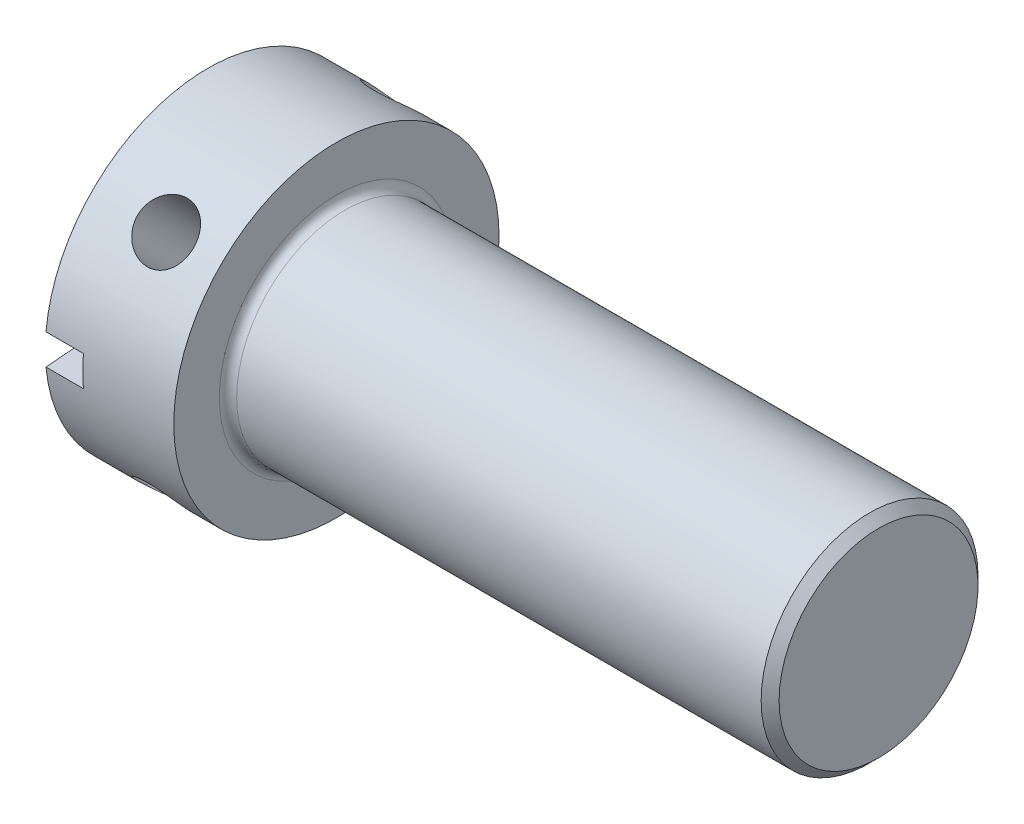
ISO-10303-21;
HEADER;
FILE_DESCRIPTION(('STEP AP214'),'2;1');
FILE_NAME('part.step','',(''),(''),'','','');
FILE_SCHEMA(('AUTOMOTIVE_DESIGN { 1 0 10303 214 1 1 1 1 }'));
ENDSEC;
DATA;
#1=APPLICATION_CONTEXT('core data for automotive mechanical design processes');
#2=APPLICATION_PROTOCOL_DEFINITION('international standard','automotive_design',2000,#1);
#3=PRODUCT_CONTEXT('',#1,'mechanical');
#4=PRODUCT('Part','Part','',(#3));
#5=PRODUCT_RELATED_PRODUCT_CATEGORY('part','',(#4));
#6=PRODUCT_DEFINITION_FORMATION('','',#4);
#7=PRODUCT_DEFINITION_CONTEXT('part definition',#1,'design');
#8=PRODUCT_DEFINITION('design','',#6,#7);
#9=PRODUCT_DEFINITION_SHAPE('','',#8);
#10=(LENGTH_UNIT() NAMED_UNIT(*) SI_UNIT(.MILLI.,.METRE.));
#11=(NAMED_UNIT(*) PLANE_ANGLE_UNIT() SI_UNIT($,.RADIAN.));
#12=(NAMED_UNIT(*) SI_UNIT($,.STERADIAN.) SOLID_ANGLE_UNIT());
#13=UNCERTAINTY_MEASURE_WITH_UNIT(LENGTH_MEASURE(1.E-05),#10,'distance_accuracy_value','');
#14=(GEOMETRIC_REPRESENTATION_CONTEXT(3) GLOBAL_UNCERTAINTY_ASSIGNED_CONTEXT((#13)) GLOBAL_UNIT_ASSIGNED_CONTEXT((#10,
#11,#12)) REPRESENTATION_CONTEXT('',''));
#15=CARTESIAN_POINT('',(0.,0.,0.));
#16=DIRECTION('',(0.,0.,1.));
#17=DIRECTION('',(1.,0.,0.));
#18=AXIS2_PLACEMENT_3D('',#15,#16,#17);
#19=CARTESIAN_POINT('',(7.35,-15.,-15.));
#20=DIRECTION('',(0.,0.707106781186546,0.707106781186549));
#21=DIRECTION('',(0.,-0.707106781186549,0.707106781186546));
#22=AXIS2_PLACEMENT_3D('',#19,#20,#21);
#23=CYLINDRICAL_SURFACE('',#22,2.59);
#24=CARTESIAN_POINT('',(7.35,8.61588734472041,12.2787004712668));
#25=CARTESIAN_POINT('',(7.49431317893943,8.61589328280588,12.2786983033954));
#26=CARTESIAN_POINT('',(7.63870324113097,8.62595636370754,12.271654071113));
#27=CARTESIAN_POINT('',(7.92342648497461,8.66579641696934,12.2435511234337));
#28=CARTESIAN_POINT('',(8.06375588911612,8.69559116639336,12.2224797703431));
#29=CARTESIAN_POINT('',(8.33619628854521,8.77359052912569,12.1666098173191));
#30=CARTESIAN_POINT('',(8.46831425556491,8.82177927012199,12.1318230516676));
#31=CARTESIAN_POINT('',(8.72081834637599,8.93459637035538,12.048977682007));
#32=CARTESIAN_POINT('',(8.84120567606902,8.99922303731351,12.0009204441451));
#33=CARTESIAN_POINT('',(9.06811660351881,9.14311619219944,11.8916626638595));
#34=CARTESIAN_POINT('',(9.17449819752444,9.22251545511193,11.8303420264751));
#35=CARTESIAN_POINT('',(9.36914339407707,9.39260855320555,11.6957532331326));
#36=CARTESIAN_POINT('',(9.45740589171919,9.48330307663166,11.6224843490574));
#37=CARTESIAN_POINT('',(9.61384359232034,9.67339833212033,11.4647586967363));
#38=CARTESIAN_POINT('',(9.68188614345174,9.77285123896529,11.3802330963039));
#39=CARTESIAN_POINT('',(9.79509929016456,9.97653165193127,11.2021023771704));
#40=CARTESIAN_POINT('',(9.84027148099626,10.0807588244852,11.1084978922812));
#41=CARTESIAN_POINT('',(9.9060259505805,10.2894983472068,10.9154124084122));
#42=CARTESIAN_POINT('',(9.92684706482816,10.3939976763809,10.8159987032624));
#43=CARTESIAN_POINT('',(9.94405143797783,10.601060134335,10.6131297793876));
#44=CARTESIAN_POINT('',(9.94043647414532,10.7036234033828,10.5096748551294));
#45=CARTESIAN_POINT('',(9.90905671178073,10.9028056755622,10.3028748341956));
#46=CARTESIAN_POINT('',(9.88154898223575,10.9994762687934,10.1995402556336));
#47=CARTESIAN_POINT('',(9.8035698164271,11.1856044025656,9.99506782693522));
#48=CARTESIAN_POINT('',(9.75309764123897,11.2750617108966,9.89393004759467));
#49=CARTESIAN_POINT('',(9.63036975450608,11.4451986208289,9.69662305942716));
#50=CARTESIAN_POINT('',(9.55800899419984,11.5258332808414,9.60048049095414));
#51=CARTESIAN_POINT('',(9.39363507257675,11.6762862581322,9.41692335155812));
#52=CARTESIAN_POINT('',(9.30162020723274,11.746103636637,9.32950953839039));
#53=CARTESIAN_POINT('',(9.09912673635516,11.874607507159,9.16540888377779));
#54=CARTESIAN_POINT('',(8.98842337997391,11.9331372787721,9.08887648655711));
#55=CARTESIAN_POINT('',(8.75245026756623,12.0370529133785,8.95080150854063));
#56=CARTESIAN_POINT('',(8.62718035738197,12.0824386372506,8.88925908640507));
#57=CARTESIAN_POINT('',(8.36536485610251,12.159496644468,8.78356111464045));
#58=CARTESIAN_POINT('',(8.22880517174112,12.1911514698394,8.73942770589612));
#59=CARTESIAN_POINT('',(7.94843515539539,12.2402395542085,8.67054451327077));
#60=CARTESIAN_POINT('',(7.80462551316458,12.257674163402,8.64579288911711));
#61=CARTESIAN_POINT('',(7.51581072318897,12.2779637088429,8.6169552740397));
#62=CARTESIAN_POINT('',(7.370844482468,12.2810025323624,8.61260864264283));
#63=CARTESIAN_POINT('',(7.08210993465183,12.2729606399599,8.62406425525349));
#64=CARTESIAN_POINT('',(6.93834157798752,12.2618805112378,8.63986566131443));
#65=CARTESIAN_POINT('',(6.65709194115679,12.2258705974114,8.69074442265164));
#66=CARTESIAN_POINT('',(6.51957434535101,12.2010361865876,8.72568901819319));
#67=CARTESIAN_POINT('',(6.2535743541972,12.1379007960608,8.8133003078363));
#68=CARTESIAN_POINT('',(6.12509253532689,12.0995989580767,8.86596813143246));
#69=CARTESIAN_POINT('',(5.87941619282921,12.0095782364109,8.98753503000309));
#70=CARTESIAN_POINT('',(5.76234558138261,11.9577306666406,9.05658916600635));
#71=CARTESIAN_POINT('',(5.54409872294892,11.8415207065088,9.20801140680446));
#72=CARTESIAN_POINT('',(5.44292368035163,11.7771573686673,9.29038051950207));
#73=CARTESIAN_POINT('',(5.25818482381671,11.6361190488457,9.46644459627652));
#74=CARTESIAN_POINT('',(5.17483112982136,11.5593141502443,9.56025616467679));
#75=CARTESIAN_POINT('',(5.02957592006818,11.3953250564873,9.75514025623027));
#76=CARTESIAN_POINT('',(4.96767367188529,11.3081412158406,9.85621253133606));
#77=CARTESIAN_POINT('',(4.86740209290306,11.1256877300873,10.0617020027407));
#78=CARTESIAN_POINT('',(4.82892468788615,11.0304575631489,10.1661014625889));
#79=CARTESIAN_POINT('',(4.77624781730335,10.8339178443047,10.3752979066374));
#80=CARTESIAN_POINT('',(4.76204620112018,10.7326088317533,10.4800948547994));
#81=CARTESIAN_POINT('',(4.75838952880307,10.528067719352,10.6855290681245));
#82=CARTESIAN_POINT('',(4.76861543321528,10.4248776911922,10.7862026828266));
#83=CARTESIAN_POINT('',(4.81283105933221,10.2183678107136,10.98204058917));
#84=CARTESIAN_POINT('',(4.84682062351466,10.11504795926,11.0772049173264));
#85=CARTESIAN_POINT('',(4.93747289375332,9.9116478275659,11.2595687048694));
#86=CARTESIAN_POINT('',(4.99410656652657,9.81156357570891,11.3467781884345));
#87=CARTESIAN_POINT('',(5.1284032109278,9.61774729140403,11.5115218191851));
#88=CARTESIAN_POINT('',(5.2060672963213,9.52401559571476,11.5890554536222));
#89=CARTESIAN_POINT('',(5.381342202685,9.34497366927442,11.7339213413449));
#90=CARTESIAN_POINT('',(5.47918582108951,9.25978072909265,11.8011169228081));
#91=CARTESIAN_POINT('',(5.69155507920338,9.10219656553529,11.9230856948683));
#92=CARTESIAN_POINT('',(5.80608462226242,9.02980834637397,11.977855971118));
#93=CARTESIAN_POINT('',(6.04961875240872,8.90011218513378,12.0745441258269));
#94=CARTESIAN_POINT('',(6.17872747423004,8.8429239748384,12.1163603670861));
#95=CARTESIAN_POINT('',(6.44701071458184,8.74675474025552,12.1859687936374));
#96=CARTESIAN_POINT('',(6.58617517352422,8.70775580316219,12.2137747784144));
#97=CARTESIAN_POINT('',(6.8298724978137,8.65789441570035,12.2491423741812));
#98=CARTESIAN_POINT('',(6.9329424503633,8.64217690929589,12.2602179525726));
#99=CARTESIAN_POINT('',(7.14066147014641,8.62117132652018,12.274997712126));
#100=CARTESIAN_POINT('',(7.24531050506905,8.61588303703921,12.2787020439115));
#101=CARTESIAN_POINT('',(7.35,8.61588734472041,12.2787004712668));
#102=B_SPLINE_CURVE_WITH_KNOTS('',3,(#24,#25,#26,#27,#28,#29,#30,#31,#32,#33,#34,#35,#36,#37,
#38,#39,#40,#41,#42,#43,#44,#45,#46,#47,#48,#49,#50,#51,#52,#53,#54,#55,#56,#57,#58,#59,#60,#61,
#62,#63,#64,#65,#66,#67,#68,#69,#70,#71,#72,#73,#74,#75,#76,#77,#78,#79,#80,#81,#82,#83,#84,#85,
#86,#87,#88,#89,#90,#91,#92,#93,#94,#95,#96,#97,#98,#99,#100,#101),.UNSPECIFIED.,.T.,.F.,(4,2,2,
2,2,2,2,2,2,2,2,2,2,2,2,2,2,2,2,2,2,2,2,2,2,2,2,2,2,2,2,2,2,2,2,2,2,2,4),(0.,0.432556630986618,
0.86550350099353,1.29807761941772,1.73060722249414,2.16723067758865,2.60388075013515,
3.04333521767696,3.4827590282259,3.91783583111185,4.35288099067683,4.78330255820216,
5.21373797633471,5.64627284920869,6.07884523844664,6.51704841038836,6.95525622025634,
7.39401956224838,7.83274123923699,8.2658434312757,8.69892761140305,9.12904565278118,
9.55919111061167,9.9935818015347,10.4280053899072,10.8672985170234,11.3065766437053,
11.7438124211379,12.181009461392,12.6125277062738,13.0440430907758,13.4750069703092,
13.9059936780497,14.342262466423,14.778633475809,15.218346263364,15.6576251024117,
15.9714222269745,16.2852129393669),.UNSPECIFIED.);
#103=CARTESIAN_POINT('',(7.35,8.61588734472041,12.2787004712668));
#104=VERTEX_POINT('',#103);
#105=EDGE_CURVE('E99',#104,#104,#102,.T.);
#106=ORIENTED_EDGE('',*,*,#105,.T.);
#107=EDGE_LOOP('',(#106));
#108=FACE_BOUND('',#107,.T.);
#109=CARTESIAN_POINT('',(7.35,0.,0.));
#110=DIRECTION('',(0.,1.,0.));
#111=DIRECTION('',(0.,0.,1.));
#112=AXIS2_PLACEMENT_3D('',#109,#110,#111);
#113=ELLIPSE('',#112,3.66281312654631,2.59);
#114=CARTESIAN_POINT('',(9.94,0.,0.));
#115=VERTEX_POINT('',#114);
#116=CARTESIAN_POINT('',(4.76,0.,0.));
#117=VERTEX_POINT('',#116);
#118=EDGE_CURVE('E45',#115,#117,#113,.F.);
#119=ORIENTED_EDGE('',*,*,#118,.T.);
#120=CARTESIAN_POINT('',(7.35,0.,0.));
#121=DIRECTION('',(0.,0.,1.));
#122=DIRECTION('',(0.,1.,0.));
#123=AXIS2_PLACEMENT_3D('',#120,#121,#122);
#124=ELLIPSE('',#123,3.66281312654632,2.59);
#125=EDGE_CURVE('E11',#117,#115,#124,.F.);
#126=ORIENTED_EDGE('',*,*,#125,.T.);
#127=EDGE_LOOP('',(#119,#126));
#128=FACE_BOUND('',#127,.T.);
#129=ADVANCED_FACE('F32',(#108,#128),#23,.F.);
#130=CARTESIAN_POINT('',(173.401923076923,0.,0.));
#131=DIRECTION('',(-1.,0.,0.));
#132=DIRECTION('',(0.,-1.,0.));
#133=AXIS2_PLACEMENT_3D('',#130,#131,#132);
#134=SPHERICAL_SURFACE('',#133,173.401923076923);
#135=CARTESIAN_POINT('',(0.649999999999998,0.,0.));
#136=DIRECTION('',(-1.,0.,0.));
#137=DIRECTION('',(0.,0.,1.));
#138=AXIS2_PLACEMENT_3D('',#135,#136,#137);
#139=CIRCLE('',#138,15.);
#140=CARTESIAN_POINT('',(0.650000000000019,1.40500000000003,14.9340542050711));
#141=VERTEX_POINT('',#140);
#142=CARTESIAN_POINT('',(0.649999999999998,1.40500000000003,-14.934054205071));
#143=VERTEX_POINT('',#142);
#144=EDGE_CURVE('E186',#141,#143,#139,.T.);
#145=ORIENTED_EDGE('',*,*,#144,.T.);
#146=CARTESIAN_POINT('',(173.401923076923,1.40500000000003,0.));
#147=DIRECTION('',(0.,-1.,0.));
#148=DIRECTION('',(0.,0.,-1.));
#149=AXIS2_PLACEMENT_3D('',#146,#147,#148);
#150=CIRCLE('',#149,173.396230933014);
#151=EDGE_CURVE('E173',#143,#141,#150,.F.);
#152=ORIENTED_EDGE('',*,*,#151,.T.);
#153=EDGE_LOOP('',(#145,#152));
#154=FACE_BOUND('',#153,.T.);
#155=ADVANCED_FACE('F145',(#154),#134,.T.);
#156=CARTESIAN_POINT('',(0.649999999999991,-1.40500000000002,-14.9340542050708));
#157=VERTEX_POINT('',#156);
#158=CARTESIAN_POINT('',(0.649999999999998,-1.40500000000046,14.934054205071));
#159=VERTEX_POINT('',#158);
#160=EDGE_CURVE('E185',#157,#159,#139,.T.);
#161=ORIENTED_EDGE('',*,*,#160,.T.);
#162=CARTESIAN_POINT('',(173.401923076923,-1.40499999999768,0.));
#163=DIRECTION('',(0.,1.,0.));
#164=DIRECTION('',(-1.,0.,0.));
#165=AXIS2_PLACEMENT_3D('',#162,#163,#164);
#166=CIRCLE('',#165,173.396230933014);
#167=EDGE_CURVE('E53',#159,#157,#166,.F.);
#168=ORIENTED_EDGE('',*,*,#167,.T.);
#169=EDGE_LOOP('',(#161,#168));
#170=FACE_BOUND('',#169,.T.);
#171=ADVANCED_FACE('F140',(#170),#134,.T.);
#172=CARTESIAN_POINT('',(-31.75,0.,0.));
#173=DIRECTION('',(-1.,0.,0.));
#174=DIRECTION('',(0.,0.,1.));
#175=AXIS2_PLACEMENT_3D('',#172,#173,#174);
#176=CYLINDRICAL_SURFACE('',#175,15.);
#177=CARTESIAN_POINT('',(7.35,8.6158873447205,-12.2787004712667));
#178=CARTESIAN_POINT('',(7.20568682106056,8.61589328280597,-12.2786983033954));
#179=CARTESIAN_POINT('',(7.06129675886903,8.62595636370763,-12.271654071113));
#180=CARTESIAN_POINT('',(6.77657351502539,8.66579641696943,-12.2435511234336));
#181=CARTESIAN_POINT('',(6.63624411088387,8.69559116639345,-12.222479770343));
#182=CARTESIAN_POINT('',(6.36380371145479,8.77359052912577,-12.166609817319));
#183=CARTESIAN_POINT('',(6.23168574443508,8.82177927012208,-12.1318230516675));
#184=CARTESIAN_POINT('',(5.97918165362401,8.93459637035546,-12.048977682007));
#185=CARTESIAN_POINT('',(5.85879432393097,8.99922303731359,-12.000920444145));
#186=CARTESIAN_POINT('',(5.63188339648118,9.14311619219953,-11.8916626638594));
#187=CARTESIAN_POINT('',(5.52550180247555,9.22251545511201,-11.830342026475));
#188=CARTESIAN_POINT('',(5.33085660592292,9.39260855320563,-11.6957532331326));
#189=CARTESIAN_POINT('',(5.2425941082808,9.48330307663175,-11.6224843490574));
#190=CARTESIAN_POINT('',(5.08615640767965,9.67339833212041,-11.4647586967362));
#191=CARTESIAN_POINT('',(5.01811385654826,9.77285123896537,-11.3802330963038));
#192=CARTESIAN_POINT('',(4.90490070983543,9.97653165193135,-11.2021023771703));
#193=CARTESIAN_POINT('',(4.85972851900374,10.0807588244853,-11.1084978922812));
#194=CARTESIAN_POINT('',(4.79397404941949,10.2894983472068,-10.9154124084121));
#195=CARTESIAN_POINT('',(4.77315293517183,10.393997676381,-10.8159987032624));
#196=CARTESIAN_POINT('',(4.75594856202216,10.601060134335,-10.6131297793875));
#197=CARTESIAN_POINT('',(4.75956352585468,10.7036234033829,-10.5096748551293));
#198=CARTESIAN_POINT('',(4.79094328821927,10.9028056755623,-10.3028748341956));
#199=CARTESIAN_POINT('',(4.81845101776424,10.9994762687934,-10.1995402556336));
#200=CARTESIAN_POINT('',(4.8964301835729,11.1856044025657,-9.99506782693514));
#201=CARTESIAN_POINT('',(4.94690235876102,11.2750617108967,-9.89393004759459));
#202=CARTESIAN_POINT('',(5.06963024549391,11.4451986208289,-9.69662305942708));
#203=CARTESIAN_POINT('',(5.14199100580015,11.5258332808415,-9.60048049095407));
#204=CARTESIAN_POINT('',(5.30636492742324,11.6762862581322,-9.41692335155804));
#205=CARTESIAN_POINT('',(5.39837979276725,11.746103636637,-9.32950953839031));
#206=CARTESIAN_POINT('',(5.60087326364483,11.874607507159,-9.16540888377771));
#207=CARTESIAN_POINT('',(5.71157662002608,11.9331372787721,-9.08887648655703));
#208=CARTESIAN_POINT('',(5.94754973243376,12.0370529133786,-8.95080150854055));
#209=CARTESIAN_POINT('',(6.07281964261803,12.0824386372507,-8.88925908640499));
#210=CARTESIAN_POINT('',(6.33463514389748,12.159496644468,-8.78356111464037));
#211=CARTESIAN_POINT('',(6.47119482825888,12.1911514698394,-8.73942770589603));
#212=CARTESIAN_POINT('',(6.7515648446046,12.2402395542086,-8.67054451327069));
#213=CARTESIAN_POINT('',(6.89537448683542,12.257674163402,-8.64579288911703));
#214=CARTESIAN_POINT('',(7.18418927681103,12.2779637088429,-8.61695527403962));
#215=CARTESIAN_POINT('',(7.32915551753199,12.2810025323625,-8.61260864264275));
#216=CARTESIAN_POINT('',(7.61789006534817,12.2729606399599,-8.6240642552534));
#217=CARTESIAN_POINT('',(7.76165842201247,12.2618805112378,-8.63986566131435));
#218=CARTESIAN_POINT('',(8.04290805884321,12.2258705974115,-8.69074442265156));
#219=CARTESIAN_POINT('',(8.18042565464898,12.2010361865877,-8.7256890181931));
#220=CARTESIAN_POINT('',(8.44642564580279,12.1379007960608,-8.81330030783622));
#221=CARTESIAN_POINT('',(8.57490746467311,12.0995989580768,-8.86596813143238));
#222=CARTESIAN_POINT('',(8.82058380717078,12.009578236411,-8.98753503000301));
#223=CARTESIAN_POINT('',(8.93765441861738,11.9577306666406,-9.05658916600627));
#224=CARTESIAN_POINT('',(9.15590127705108,11.8415207065088,-9.20801140680438));
#225=CARTESIAN_POINT('',(9.25707631964836,11.7771573686674,-9.29038051950198));
#226=CARTESIAN_POINT('',(9.44181517618329,11.6361190488458,-9.46644459627644));
#227=CARTESIAN_POINT('',(9.52516887017864,11.5593141502443,-9.56025616467672));
#228=CARTESIAN_POINT('',(9.67042407993182,11.3953250564873,-9.7551402562302));
#229=CARTESIAN_POINT('',(9.73232632811471,11.3081412158406,-9.85621253133598));
#230=CARTESIAN_POINT('',(9.83259790709694,11.1256877300873,-10.0617020027406));
#231=CARTESIAN_POINT('',(9.87107531211385,11.030457563149,-10.1661014625888));
#232=CARTESIAN_POINT('',(9.92375218269665,10.8339178443048,-10.3752979066373));
#233=CARTESIAN_POINT('',(9.93795379887982,10.7326088317534,-10.4800948547993));
#234=CARTESIAN_POINT('',(9.94161047119693,10.5280677193521,-10.6855290681245));
#235=CARTESIAN_POINT('',(9.93138456678471,10.4248776911923,-10.7862026828265));
#236=CARTESIAN_POINT('',(9.88716894066778,10.2183678107137,-10.98204058917));
#237=CARTESIAN_POINT('',(9.85317937648534,10.1150479592601,-11.0772049173263));
#238=CARTESIAN_POINT('',(9.76252710624668,9.91164782756598,-11.2595687048693));
#239=CARTESIAN_POINT('',(9.70589343347343,9.81156357570899,-11.3467781884344));
#240=CARTESIAN_POINT('',(9.57159678907219,9.61774729140411,-11.511521819185));
#241=CARTESIAN_POINT('',(9.49393270367869,9.52401559571484,-11.5890554536221));
#242=CARTESIAN_POINT('',(9.318657797315,9.3449736692745,-11.7339213413449));
#243=CARTESIAN_POINT('',(9.22081417891048,9.25978072909273,-11.801116922808));
#244=CARTESIAN_POINT('',(9.00844492079662,9.10219656553537,-11.9230856948683));
#245=CARTESIAN_POINT('',(8.89391537773758,9.02980834637405,-11.977855971118));
#246=CARTESIAN_POINT('',(8.65038124759128,8.90011218513386,-12.0745441258268));
#247=CARTESIAN_POINT('',(8.52127252576996,8.84292397483848,-12.116360367086));
#248=CARTESIAN_POINT('',(8.25298928541815,8.7467547402556,-12.1859687936373));
#249=CARTESIAN_POINT('',(8.11382482647578,8.70775580316228,-12.2137747784143));
#250=CARTESIAN_POINT('',(7.87012750218629,8.65789441570043,-12.2491423741811));
#251=CARTESIAN_POINT('',(7.76705754963669,8.64217690929597,-12.2602179525725));
#252=CARTESIAN_POINT('',(7.55933852985358,8.62117132652027,-12.2749977121259));
#253=CARTESIAN_POINT('',(7.45468949493094,8.61588303703929,-12.2787020439114));
#254=CARTESIAN_POINT('',(7.35,8.6158873447205,-12.2787004712667));
#255=B_SPLINE_CURVE_WITH_KNOTS('',3,(#177,#178,#179,#180,#181,#182,#183,#184,#185,#186,#187,
#188,#189,#190,#191,#192,#193,#194,#195,#196,#197,#198,#199,#200,#201,#202,#203,#204,#205,#206,
#207,#208,#209,#210,#211,#212,#213,#214,#215,#216,#217,#218,#219,#220,#221,#222,#223,#224,#225,
#226,#227,#228,#229,#230,#231,#232,#233,#234,#235,#236,#237,#238,#239,#240,#241,#242,#243,#244,
#245,#246,#247,#248,#249,#250,#251,#252,#253,#254),.UNSPECIFIED.,.T.,.F.,(4,2,2,2,2,2,2,2,2,2,2,
2,2,2,2,2,2,2,2,2,2,2,2,2,2,2,2,2,2,2,2,2,2,2,2,2,2,2,4),(0.,0.432556630986617,
0.865503500993529,1.29807761941772,1.73060722249414,2.16723067758865,2.60388075013515,
3.04333521767696,3.4827590282259,3.91783583111185,4.35288099067683,4.78330255820216,
5.21373797633471,5.64627284920868,6.07884523844664,6.51704841038836,6.95525622025634,
7.39401956224838,7.83274123923699,8.2658434312757,8.69892761140305,9.12904565278118,
9.55919111061167,9.9935818015347,10.4280053899072,10.8672985170234,11.3065766437053,
11.7438124211379,12.181009461392,12.6125277062738,13.0440430907758,13.4750069703092,
13.9059936780497,14.342262466423,14.778633475809,15.218346263364,15.6576251024117,
15.9714222269745,16.2852129393669),.UNSPECIFIED.);
#256=CARTESIAN_POINT('',(7.35,8.6158873447205,-12.2787004712667));
#257=VERTEX_POINT('',#256);
#258=EDGE_CURVE('E154',#257,#257,#255,.T.);
#259=ORIENTED_EDGE('',*,*,#258,.F.);
#260=EDGE_LOOP('',(#259));
#261=FACE_BOUND('',#260,.T.);
#262=CARTESIAN_POINT('',(7.35,-12.2787004712668,8.61588734472037));
#263=CARTESIAN_POINT('',(7.49431317893943,-12.2786983033954,8.61589328280583));
#264=CARTESIAN_POINT('',(7.63870324113097,-12.2716540711131,8.6259563637075));
#265=CARTESIAN_POINT('',(7.9234264849746,-12.2435511234337,8.6657964169693));
#266=CARTESIAN_POINT('',(8.06375588911612,-12.2224797703431,8.69559116639332));
#267=CARTESIAN_POINT('',(8.33619628854521,-12.1666098173191,8.77359052912564));
#268=CARTESIAN_POINT('',(8.46831425556491,-12.1318230516676,8.82177927012195));
#269=CARTESIAN_POINT('',(8.72081834637599,-12.0489776820071,8.93459637035533));
#270=CARTESIAN_POINT('',(8.84120567606902,-12.0009204441451,8.99922303731346));
#271=CARTESIAN_POINT('',(9.06811660351881,-11.8916626638595,9.1431161921994));
#272=CARTESIAN_POINT('',(9.17449819752444,-11.8303420264751,9.22251545511188));
#273=CARTESIAN_POINT('',(9.36914339407707,-11.6957532331327,9.39260855320551));
#274=CARTESIAN_POINT('',(9.45740589171919,-11.6224843490575,9.48330307663162));
#275=CARTESIAN_POINT('',(9.61384359232034,-11.4647586967363,9.67339833212029));
#276=CARTESIAN_POINT('',(9.68188614345174,-11.3802330963039,9.77285123896525));
#277=CARTESIAN_POINT('',(9.79509929016456,-11.2021023771704,9.97653165193123));
#278=CARTESIAN_POINT('',(9.84027148099626,-11.1084978922813,10.0807588244851));
#279=CARTESIAN_POINT('',(9.9060259505805,-10.9154124084122,10.2894983472067));
#280=CARTESIAN_POINT('',(9.92684706482816,-10.8159987032625,10.3939976763808));
#281=CARTESIAN_POINT('',(9.94405143797783,-10.6131297793877,10.6010601343349));
#282=CARTESIAN_POINT('',(9.94043647414532,-10.5096748551294,10.7036234033828));
#283=CARTESIAN_POINT('',(9.90905671178073,-10.3028748341957,10.9028056755622));
#284=CARTESIAN_POINT('',(9.88154898223575,-10.1995402556337,10.9994762687933));
#285=CARTESIAN_POINT('',(9.8035698164271,-9.99506782693526,11.1856044025656));
#286=CARTESIAN_POINT('',(9.75309764123897,-9.89393004759471,11.2750617108966));
#287=CARTESIAN_POINT('',(9.63036975450608,-9.6966230594272,11.4451986208289));
#288=CARTESIAN_POINT('',(9.55800899419985,-9.60048049095419,11.5258332808414));
#289=CARTESIAN_POINT('',(9.39363507257675,-9.41692335155816,11.6762862581321));
#290=CARTESIAN_POINT('',(9.30162020723275,-9.32950953839043,11.7461036366369));
#291=CARTESIAN_POINT('',(9.09912673635516,-9.16540888377783,11.8746075071589));
#292=CARTESIAN_POINT('',(8.98842337997391,-9.08887648655715,11.933137278772));
#293=CARTESIAN_POINT('',(8.75245026756623,-8.95080150854068,12.0370529133785));
#294=CARTESIAN_POINT('',(8.62718035738197,-8.88925908640512,12.0824386372506));
#295=CARTESIAN_POINT('',(8.36536485610251,-8.7835611146405,12.1594966444679));
#296=CARTESIAN_POINT('',(8.22880517174112,-8.73942770589616,12.1911514698394));
#297=CARTESIAN_POINT('',(7.94843515539539,-8.67054451327082,12.2402395542085));
#298=CARTESIAN_POINT('',(7.80462551316458,-8.64579288911716,12.2576741634019));
#299=CARTESIAN_POINT('',(7.51581072318897,-8.61695527403975,12.2779637088428));
#300=CARTESIAN_POINT('',(7.370844482468,-8.61260864264288,12.2810025323624));
#301=CARTESIAN_POINT('',(7.08210993465182,-8.62406425525353,12.2729606399598));
#302=CARTESIAN_POINT('',(6.93834157798752,-8.63986566131448,12.2618805112377));
#303=CARTESIAN_POINT('',(6.65709194115679,-8.69074442265168,12.2258705974114));
#304=CARTESIAN_POINT('',(6.51957434535101,-8.72568901819323,12.2010361865876));
#305=CARTESIAN_POINT('',(6.2535743541972,-8.81330030783635,12.1379007960607));
#306=CARTESIAN_POINT('',(6.12509253532689,-8.86596813143251,12.0995989580767));
#307=CARTESIAN_POINT('',(5.87941619282921,-8.98753503000314,12.0095782364109));
#308=CARTESIAN_POINT('',(5.76234558138261,-9.0565891660064,11.9577306666405));
#309=CARTESIAN_POINT('',(5.54409872294891,-9.20801140680451,11.8415207065087));
#310=CARTESIAN_POINT('',(5.44292368035163,-9.29038051950211,11.7771573686673));
#311=CARTESIAN_POINT('',(5.2581848238167,-9.46644459627656,11.6361190488457));
#312=CARTESIAN_POINT('',(5.17483112982136,-9.56025616467684,11.5593141502442));
#313=CARTESIAN_POINT('',(5.02957592006818,-9.75514025623032,11.3953250564872));
#314=CARTESIAN_POINT('',(4.96767367188529,-9.8562125313361,11.3081412158405));
#315=CARTESIAN_POINT('',(4.86740209290306,-10.0617020027407,11.1256877300872));
#316=CARTESIAN_POINT('',(4.82892468788615,-10.1661014625889,11.0304575631489));
#317=CARTESIAN_POINT('',(4.77624781730335,-10.3752979066374,10.8339178443047));
#318=CARTESIAN_POINT('',(4.76204620112018,-10.4800948547994,10.7326088317533));
#319=CARTESIAN_POINT('',(4.75838952880307,-10.6855290681246,10.528067719352));
#320=CARTESIAN_POINT('',(4.76861543321528,-10.7862026828266,10.4248776911922));
#321=CARTESIAN_POINT('',(4.81283105933221,-10.9820405891701,10.2183678107136));
#322=CARTESIAN_POINT('',(4.84682062351466,-11.0772049173264,10.1150479592599));
#323=CARTESIAN_POINT('',(4.93747289375332,-11.2595687048694,9.91164782756585));
#324=CARTESIAN_POINT('',(4.99410656652657,-11.3467781884345,9.81156357570887));
#325=CARTESIAN_POINT('',(5.1284032109278,-11.5115218191851,9.61774729140399));
#326=CARTESIAN_POINT('',(5.2060672963213,-11.5890554536222,9.52401559571472));
#327=CARTESIAN_POINT('',(5.38134220268499,-11.733921341345,9.34497366927438));
#328=CARTESIAN_POINT('',(5.47918582108951,-11.8011169228081,9.25978072909261));
#329=CARTESIAN_POINT('',(5.69155507920338,-11.9230856948683,9.10219656553525));
#330=CARTESIAN_POINT('',(5.80608462226242,-11.9778559711181,9.02980834637393));
#331=CARTESIAN_POINT('',(6.04961875240872,-12.0745441258269,8.90011218513373));
#332=CARTESIAN_POINT('',(6.17872747423004,-12.1163603670861,8.84292397483835));
#333=CARTESIAN_POINT('',(6.44701071458184,-12.1859687936374,8.74675474025547));
#334=CARTESIAN_POINT('',(6.58617517352422,-12.2137747784144,8.70775580316215));
#335=CARTESIAN_POINT('',(6.82987249781371,-12.2491423741812,8.65789441570031));
#336=CARTESIAN_POINT('',(6.93294245036331,-12.2602179525726,8.64217690929584));
#337=CARTESIAN_POINT('',(7.14066147014641,-12.274997712126,8.62117132652014));
#338=CARTESIAN_POINT('',(7.24531050506905,-12.2787020439115,8.61588303703916));
#339=CARTESIAN_POINT('',(7.35,-12.2787004712668,8.61588734472037));
#340=B_SPLINE_CURVE_WITH_KNOTS('',3,(#262,#263,#264,#265,#266,#267,#268,#269,#270,#271,#272,
#273,#274,#275,#276,#277,#278,#279,#280,#281,#282,#283,#284,#285,#286,#287,#288,#289,#290,#291,
#292,#293,#294,#295,#296,#297,#298,#299,#300,#301,#302,#303,#304,#305,#306,#307,#308,#309,#310,
#311,#312,#313,#314,#315,#316,#317,#318,#319,#320,#321,#322,#323,#324,#325,#326,#327,#328,#329,
#330,#331,#332,#333,#334,#335,#336,#337,#338,#339),.UNSPECIFIED.,.T.,.F.,(4,2,2,2,2,2,2,2,2,2,2,
2,2,2,2,2,2,2,2,2,2,2,2,2,2,2,2,2,2,2,2,2,2,2,2,2,2,2,4),(0.,0.432556630986616,
0.865503500993528,1.29807761941772,1.73060722249414,2.16723067758865,2.60388075013514,
3.04333521767696,3.4827590282259,3.91783583111185,4.35288099067683,4.78330255820215,
5.21373797633471,5.64627284920868,6.07884523844664,6.51704841038836,6.95525622025634,
7.39401956224838,7.83274123923699,8.2658434312757,8.69892761140305,9.12904565278118,
9.55919111061167,9.9935818015347,10.4280053899072,10.8672985170234,11.3065766437053,
11.7438124211379,12.181009461392,12.6125277062738,13.0440430907758,13.4750069703092,
13.9059936780497,14.342262466423,14.778633475809,15.218346263364,15.6576251024117,
15.9714222269745,16.2852129393669),.UNSPECIFIED.);
#341=CARTESIAN_POINT('',(7.35,-12.2787004712668,8.61588734472037));
#342=VERTEX_POINT('',#341);
#343=EDGE_CURVE('E156',#342,#342,#340,.T.);
#344=ORIENTED_EDGE('',*,*,#343,.F.);
#345=EDGE_LOOP('',(#344));
#346=FACE_BOUND('',#345,.T.);
#347=CARTESIAN_POINT('',(7.35,-12.2787004712667,-8.61588734472045));
#348=CARTESIAN_POINT('',(7.20568682106056,-12.2786983033954,-8.61589328280592));
#349=CARTESIAN_POINT('',(7.06129675886903,-12.271654071113,-8.62595636370759));
#350=CARTESIAN_POINT('',(6.77657351502539,-12.2435511234337,-8.66579641696938));
#351=CARTESIAN_POINT('',(6.63624411088387,-12.2224797703431,-8.69559116639341));
#352=CARTESIAN_POINT('',(6.36380371145479,-12.1666098173191,-8.77359052912573));
#353=CARTESIAN_POINT('',(6.23168574443508,-12.1318230516676,-8.82177927012204));
#354=CARTESIAN_POINT('',(5.97918165362401,-12.048977682007,-8.93459637035542));
#355=CARTESIAN_POINT('',(5.85879432393097,-12.000920444145,-8.99922303731355));
#356=CARTESIAN_POINT('',(5.63188339648118,-11.8916626638594,-9.14311619219949));
#357=CARTESIAN_POINT('',(5.52550180247555,-11.8303420264751,-9.22251545511197));
#358=CARTESIAN_POINT('',(5.33085660592292,-11.6957532331326,-9.39260855320559));
#359=CARTESIAN_POINT('',(5.2425941082808,-11.6224843490574,-9.4833030766317));
#360=CARTESIAN_POINT('',(5.08615640767965,-11.4647586967363,-9.67339833212037));
#361=CARTESIAN_POINT('',(5.01811385654826,-11.3802330963039,-9.77285123896533));
#362=CARTESIAN_POINT('',(4.90490070983543,-11.2021023771703,-9.97653165193131));
#363=CARTESIAN_POINT('',(4.85972851900374,-11.1084978922812,-10.0807588244852));
#364=CARTESIAN_POINT('',(4.79397404941949,-10.9154124084121,-10.2894983472068));
#365=CARTESIAN_POINT('',(4.77315293517183,-10.8159987032624,-10.3939976763809));
#366=CARTESIAN_POINT('',(4.75594856202216,-10.6131297793876,-10.601060134335));
#367=CARTESIAN_POINT('',(4.75956352585468,-10.5096748551294,-10.7036234033829));
#368=CARTESIAN_POINT('',(4.79094328821927,-10.3028748341956,-10.9028056755622));
#369=CARTESIAN_POINT('',(4.81845101776425,-10.1995402556336,-10.9994762687934));
#370=CARTESIAN_POINT('',(4.8964301835729,-9.99506782693518,-11.1856044025657));
#371=CARTESIAN_POINT('',(4.94690235876103,-9.89393004759463,-11.2750617108966));
#372=CARTESIAN_POINT('',(5.06963024549391,-9.69662305942712,-11.4451986208289));
#373=CARTESIAN_POINT('',(5.14199100580015,-9.6004804909541,-11.5258332808414));
#374=CARTESIAN_POINT('',(5.30636492742324,-9.41692335155808,-11.6762862581322));
#375=CARTESIAN_POINT('',(5.39837979276725,-9.32950953839035,-11.746103636637));
#376=CARTESIAN_POINT('',(5.60087326364483,-9.16540888377775,-11.874607507159));
#377=CARTESIAN_POINT('',(5.71157662002608,-9.08887648655707,-11.9331372787721));
#378=CARTESIAN_POINT('',(5.94754973243376,-8.95080150854059,-12.0370529133785));
#379=CARTESIAN_POINT('',(6.07281964261803,-8.88925908640503,-12.0824386372506));
#380=CARTESIAN_POINT('',(6.33463514389748,-8.78356111464041,-12.159496644468));
#381=CARTESIAN_POINT('',(6.47119482825888,-8.73942770589608,-12.1911514698394));
#382=CARTESIAN_POINT('',(6.7515648446046,-8.67054451327074,-12.2402395542086));
#383=CARTESIAN_POINT('',(6.89537448683542,-8.64579288911707,-12.257674163402));
#384=CARTESIAN_POINT('',(7.18418927681103,-8.61695527403966,-12.2779637088429));
#385=CARTESIAN_POINT('',(7.32915551753199,-8.61260864264279,-12.2810025323625));
#386=CARTESIAN_POINT('',(7.61789006534817,-8.62406425525344,-12.2729606399599));
#387=CARTESIAN_POINT('',(7.76165842201248,-8.63986566131439,-12.2618805112378));
#388=CARTESIAN_POINT('',(8.04290805884321,-8.6907444226516,-12.2258705974115));
#389=CARTESIAN_POINT('',(8.18042565464899,-8.72568901819315,-12.2010361865877));
#390=CARTESIAN_POINT('',(8.44642564580279,-8.81330030783626,-12.1379007960608));
#391=CARTESIAN_POINT('',(8.57490746467311,-8.86596813143242,-12.0995989580767));
#392=CARTESIAN_POINT('',(8.82058380717078,-8.98753503000305,-12.009578236411));
#393=CARTESIAN_POINT('',(8.93765441861738,-9.05658916600631,-11.9577306666406));
#394=CARTESIAN_POINT('',(9.15590127705108,-9.20801140680442,-11.8415207065088));
#395=CARTESIAN_POINT('',(9.25707631964837,-9.29038051950203,-11.7771573686674));
#396=CARTESIAN_POINT('',(9.44181517618329,-9.46644459627648,-11.6361190488458));
#397=CARTESIAN_POINT('',(9.52516887017864,-9.56025616467676,-11.5593141502443));
#398=CARTESIAN_POINT('',(9.67042407993182,-9.75514025623024,-11.3953250564873));
#399=CARTESIAN_POINT('',(9.73232632811471,-9.85621253133602,-11.3081412158406));
#400=CARTESIAN_POINT('',(9.83259790709694,-10.0617020027407,-11.1256877300873));
#401=CARTESIAN_POINT('',(9.87107531211384,-10.1661014625888,-11.0304575631489));
#402=CARTESIAN_POINT('',(9.92375218269664,-10.3752979066374,-10.8339178443048));
#403=CARTESIAN_POINT('',(9.93795379887982,-10.4800948547994,-10.7326088317534));
#404=CARTESIAN_POINT('',(9.94161047119693,-10.6855290681245,-10.5280677193521));
#405=CARTESIAN_POINT('',(9.93138456678471,-10.7862026828265,-10.4248776911922));
#406=CARTESIAN_POINT('',(9.88716894066778,-10.98204058917,-10.2183678107137));
#407=CARTESIAN_POINT('',(9.85317937648534,-11.0772049173263,-10.11504795926));
#408=CARTESIAN_POINT('',(9.76252710624668,-11.2595687048693,-9.91164782756594));
#409=CARTESIAN_POINT('',(9.70589343347343,-11.3467781884345,-9.81156357570895));
#410=CARTESIAN_POINT('',(9.57159678907219,-11.511521819185,-9.61774729140407));
#411=CARTESIAN_POINT('',(9.49393270367869,-11.5890554536221,-9.52401559571481));
#412=CARTESIAN_POINT('',(9.318657797315,-11.7339213413449,-9.34497366927446));
#413=CARTESIAN_POINT('',(9.22081417891048,-11.8011169228081,-9.25978072909269));
#414=CARTESIAN_POINT('',(9.00844492079662,-11.9230856948683,-9.10219656553533));
#415=CARTESIAN_POINT('',(8.89391537773758,-11.977855971118,-9.02980834637401));
#416=CARTESIAN_POINT('',(8.65038124759128,-12.0745441258268,-8.90011218513382));
#417=CARTESIAN_POINT('',(8.52127252576996,-12.116360367086,-8.84292397483844));
#418=CARTESIAN_POINT('',(8.25298928541815,-12.1859687936374,-8.74675474025556));
#419=CARTESIAN_POINT('',(8.11382482647578,-12.2137747784143,-8.70775580316224));
#420=CARTESIAN_POINT('',(7.87012750218629,-12.2491423741812,-8.65789441570039));
#421=CARTESIAN_POINT('',(7.76705754963669,-12.2602179525726,-8.64217690929593));
#422=CARTESIAN_POINT('',(7.55933852985358,-12.274997712126,-8.62117132652022));
#423=CARTESIAN_POINT('',(7.45468949493094,-12.2787020439114,-8.61588303703925));
#424=CARTESIAN_POINT('',(7.35,-12.2787004712667,-8.61588734472045));
#425=B_SPLINE_CURVE_WITH_KNOTS('',3,(#347,#348,#349,#350,#351,#352,#353,#354,#355,#356,#357,
#358,#359,#360,#361,#362,#363,#364,#365,#366,#367,#368,#369,#370,#371,#372,#373,#374,#375,#376,
#377,#378,#379,#380,#381,#382,#383,#384,#385,#386,#387,#388,#389,#390,#391,#392,#393,#394,#395,
#396,#397,#398,#399,#400,#401,#402,#403,#404,#405,#406,#407,#408,#409,#410,#411,#412,#413,#414,
#415,#416,#417,#418,#419,#420,#421,#422,#423,#424),.UNSPECIFIED.,.T.,.F.,(4,2,2,2,2,2,2,2,2,2,2,
2,2,2,2,2,2,2,2,2,2,2,2,2,2,2,2,2,2,2,2,2,2,2,2,2,2,2,4),(0.,0.432556630986618,
0.865503500993529,1.29807761941772,1.73060722249414,2.16723067758865,2.60388075013515,
3.04333521767696,3.4827590282259,3.91783583111185,4.35288099067683,4.78330255820216,
5.21373797633471,5.64627284920868,6.07884523844664,6.51704841038836,6.95525622025634,
7.39401956224838,7.83274123923699,8.2658434312757,8.69892761140305,9.12904565278118,
9.55919111061167,9.9935818015347,10.4280053899072,10.8672985170234,11.3065766437053,
11.7438124211379,12.181009461392,12.6125277062738,13.0440430907758,13.4750069703092,
13.9059936780497,14.342262466423,14.778633475809,15.218346263364,15.6576251024117,
15.9714222269745,16.2852129393669),.UNSPECIFIED.);
#426=CARTESIAN_POINT('',(7.35,-12.2787004712667,-8.61588734472045));
#427=VERTEX_POINT('',#426);
#428=EDGE_CURVE('E91',#427,#427,#425,.T.);
#429=ORIENTED_EDGE('',*,*,#428,.F.);
#430=EDGE_LOOP('',(#429));
#431=FACE_BOUND('',#430,.T.);
#432=ORIENTED_EDGE('',*,*,#105,.F.);
#433=EDGE_LOOP('',(#432));
#434=FACE_BOUND('',#433,.T.);
#435=CARTESIAN_POINT('',(12.5,0.,0.));
#436=DIRECTION('',(-1.,0.,0.));
#437=DIRECTION('',(0.,0.,1.));
#438=AXIS2_PLACEMENT_3D('',#435,#436,#437);
#439=CIRCLE('',#438,15.);
#440=CARTESIAN_POINT('',(12.5,0.,15.));
#441=VERTEX_POINT('',#440);
#442=EDGE_CURVE('E182',#441,#441,#439,.T.);
#443=ORIENTED_EDGE('',*,*,#442,.T.);
#444=EDGE_LOOP('',(#443));
#445=FACE_BOUND('',#444,.T.);
#446=CARTESIAN_POINT('',(4.10569214390901,0.,0.));
#447=DIRECTION('',(-1.,0.,0.));
#448=DIRECTION('',(0.,0.,1.));
#449=AXIS2_PLACEMENT_3D('',#446,#447,#448);
#450=CIRCLE('',#449,15.);
#451=CARTESIAN_POINT('',(4.10569214390901,-1.40499999999997,-14.934054205071));
#452=VERTEX_POINT('',#451);
#453=CARTESIAN_POINT('',(4.10569214390901,1.40500000000003,-14.934054205071));
#454=VERTEX_POINT('',#453);
#455=EDGE_CURVE('E200',#452,#454,#450,.F.);
#456=ORIENTED_EDGE('',*,*,#455,.T.);
#457=DIRECTION('',(-1.,0.,0.));
#458=VECTOR('',#457,1.);
#459=CARTESIAN_POINT('',(-31.75,1.40500000000003,-14.934054205071));
#460=LINE('',#459,#458);
#461=EDGE_CURVE('E86',#454,#143,#460,.T.);
#462=ORIENTED_EDGE('',*,*,#461,.T.);
#463=ORIENTED_EDGE('',*,*,#144,.F.);
#464=DIRECTION('',(-1.,0.,0.));
#465=VECTOR('',#464,1.);
#466=CARTESIAN_POINT('',(-31.75,1.40500000000003,14.934054205071));
#467=LINE('',#466,#465);
#468=CARTESIAN_POINT('',(4.10569214390901,1.40500000000003,14.934054205071));
#469=VERTEX_POINT('',#468);
#470=EDGE_CURVE('E199',#141,#469,#467,.F.);
#471=ORIENTED_EDGE('',*,*,#470,.T.);
#472=CARTESIAN_POINT('',(4.10569214390901,-1.40499999999997,14.934054205071));
#473=VERTEX_POINT('',#472);
#474=EDGE_CURVE('E196',#469,#473,#450,.F.);
#475=ORIENTED_EDGE('',*,*,#474,.T.);
#476=DIRECTION('',(-1.,0.,0.));
#477=VECTOR('',#476,1.);
#478=CARTESIAN_POINT('',(-31.7499999999999,-1.40500000000046,14.934054205071));
#479=LINE('',#478,#477);
#480=EDGE_CURVE('E194',#473,#159,#479,.T.);
#481=ORIENTED_EDGE('',*,*,#480,.T.);
#482=ORIENTED_EDGE('',*,*,#160,.F.);
#483=DIRECTION('',(-1.,0.,0.));
#484=VECTOR('',#483,1.);
#485=CARTESIAN_POINT('',(-31.7499999999999,-1.40500000000046,-14.934054205071));
#486=LINE('',#485,#484);
#487=EDGE_CURVE('E203',#157,#452,#486,.F.);
#488=ORIENTED_EDGE('',*,*,#487,.T.);
#489=EDGE_LOOP('',(#456,#462,#463,#471,#475,#481,#482,#488));
#490=FACE_BOUND('',#489,.T.);
#491=ADVANCED_FACE('F103',(#261,#346,#431,#434,#445,#490),#176,.T.);
#492=CARTESIAN_POINT('',(12.5,15.,0.));
#493=DIRECTION('',(1.,0.,0.));
#494=DIRECTION('',(0.,0.,-1.));
#495=AXIS2_PLACEMENT_3D('',#492,#493,#494);
#496=PLANE('',#495);
#497=CARTESIAN_POINT('',(12.5,0.,0.));
#498=DIRECTION('',(1.,0.,0.));
#499=DIRECTION('',(0.,0.,-1.));
#500=AXIS2_PLACEMENT_3D('',#497,#498,#499);
#501=CIRCLE('',#500,10.8);
#502=CARTESIAN_POINT('',(12.5,0.,-10.8));
#503=VERTEX_POINT('',#502);
#504=EDGE_CURVE('E189',#503,#503,#501,.F.);
#505=ORIENTED_EDGE('',*,*,#504,.T.);
#506=EDGE_LOOP('',(#505));
#507=FACE_BOUND('',#506,.T.);
#508=ORIENTED_EDGE('',*,*,#442,.F.);
#509=EDGE_LOOP('',(#508));
#510=FACE_BOUND('',#509,.T.);
#511=ADVANCED_FACE('F133',(#507,#510),#496,.T.);
#512=CARTESIAN_POINT('',(-31.75,0.,0.));
#513=DIRECTION('',(-1.,0.,0.));
#514=DIRECTION('',(0.,0.,1.));
#515=AXIS2_PLACEMENT_3D('',#512,#513,#514);
#516=CYLINDRICAL_SURFACE('',#515,10.);
#517=CARTESIAN_POINT('',(13.3,0.,0.));
#518=DIRECTION('',(1.,0.,0.));
#519=DIRECTION('',(0.,0.,-1.));
#520=AXIS2_PLACEMENT_3D('',#517,#518,#519);
#521=CIRCLE('',#520,10.);
#522=CARTESIAN_POINT('',(13.3,0.,-10.));
#523=VERTEX_POINT('',#522);
#524=EDGE_CURVE('E191',#523,#523,#521,.T.);
#525=ORIENTED_EDGE('',*,*,#524,.T.);
#526=EDGE_LOOP('',(#525));
#527=FACE_BOUND('',#526,.T.);
#528=CARTESIAN_POINT('',(61.6719999999999,0.,0.));
#529=DIRECTION('',(-1.,0.,0.));
#530=DIRECTION('',(0.,0.,1.));
#531=AXIS2_PLACEMENT_3D('',#528,#529,#530);
#532=CIRCLE('',#531,10.);
#533=CARTESIAN_POINT('',(61.6719999999999,0.,10.));
#534=VERTEX_POINT('',#533);
#535=EDGE_CURVE('E179',#534,#534,#532,.T.);
#536=ORIENTED_EDGE('',*,*,#535,.T.);
#537=EDGE_LOOP('',(#536));
#538=FACE_BOUND('',#537,.T.);
#539=ADVANCED_FACE('F130',(#527,#538),#516,.T.);
#540=CARTESIAN_POINT('',(62.5,0.,0.));
#541=DIRECTION('',(-1.,0.,0.));
#542=DIRECTION('',(0.,0.,1.));
#543=AXIS2_PLACEMENT_3D('',#540,#541,#542);
#544=CONICAL_SURFACE('',#543,9.172,0.78539816339741);
#545=ORIENTED_EDGE('',*,*,#535,.F.);
#546=EDGE_LOOP('',(#545));
#547=FACE_BOUND('',#546,.T.);
#548=CARTESIAN_POINT('',(62.5,0.,0.));
#549=DIRECTION('',(-1.,0.,0.));
#550=DIRECTION('',(0.,0.,1.));
#551=AXIS2_PLACEMENT_3D('',#548,#549,#550);
#552=CIRCLE('',#551,9.172);
#553=CARTESIAN_POINT('',(62.5,0.,9.172));
#554=VERTEX_POINT('',#553);
#555=EDGE_CURVE('E176',#554,#554,#552,.T.);
#556=ORIENTED_EDGE('',*,*,#555,.T.);
#557=EDGE_LOOP('',(#556));
#558=FACE_BOUND('',#557,.T.);
#559=ADVANCED_FACE('F126',(#547,#558),#544,.T.);
#560=CARTESIAN_POINT('',(62.5,9.172,0.));
#561=DIRECTION('',(1.,0.,0.));
#562=DIRECTION('',(0.,0.,-1.));
#563=AXIS2_PLACEMENT_3D('',#560,#561,#562);
#564=PLANE('',#563);
#565=ORIENTED_EDGE('',*,*,#555,.F.);
#566=EDGE_LOOP('',(#565));
#567=FACE_BOUND('',#566,.T.);
#568=ADVANCED_FACE('F123',(#567),#564,.T.);
#569=CARTESIAN_POINT('',(13.3,0.,0.));
#570=DIRECTION('',(1.,0.,0.));
#571=DIRECTION('',(0.,0.,-1.));
#572=AXIS2_PLACEMENT_3D('',#569,#570,#571);
#573=TOROIDAL_SURFACE('',#572,10.8,0.8);
#574=ORIENTED_EDGE('',*,*,#524,.F.);
#575=EDGE_LOOP('',(#574));
#576=FACE_BOUND('',#575,.T.);
#577=ORIENTED_EDGE('',*,*,#504,.F.);
#578=EDGE_LOOP('',(#577));
#579=FACE_BOUND('',#578,.T.);
#580=ADVANCED_FACE('F34',(#576,#579),#573,.F.);
#581=CARTESIAN_POINT('',(0.00569214390901129,1.40500000000003,113.174655810863));
#582=DIRECTION('',(0.,-1.,0.));
#583=DIRECTION('',(0.,0.,-1.));
#584=AXIS2_PLACEMENT_3D('',#581,#582,#583);
#585=PLANE('',#584);
#586=ORIENTED_EDGE('',*,*,#470,.F.);
#587=ORIENTED_EDGE('',*,*,#151,.F.);
#588=ORIENTED_EDGE('',*,*,#461,.F.);
#589=DIRECTION('',(0.,0.,-1.));
#590=VECTOR('',#589,1.);
#591=CARTESIAN_POINT('',(4.10569214390901,1.40500000000003,113.174655810863));
#592=LINE('',#591,#590);
#593=EDGE_CURVE('E169',#469,#454,#592,.T.);
#594=ORIENTED_EDGE('',*,*,#593,.F.);
#595=EDGE_LOOP('',(#586,#587,#588,#594));
#596=FACE_BOUND('',#595,.T.);
#597=ADVANCED_FACE('F118',(#596),#585,.T.);
#598=CARTESIAN_POINT('',(4.10569214390901,1.40500000000003,113.174655810863));
#599=DIRECTION('',(-1.,0.,0.));
#600=DIRECTION('',(0.,0.,1.));
#601=AXIS2_PLACEMENT_3D('',#598,#599,#600);
#602=PLANE('',#601);
#603=ORIENTED_EDGE('',*,*,#455,.F.);
#604=DIRECTION('',(0.,0.,-1.));
#605=VECTOR('',#604,1.);
#606=CARTESIAN_POINT('',(4.10569214390901,-1.40499999999997,113.174655810863));
#607=LINE('',#606,#605);
#608=EDGE_CURVE('E98',#473,#452,#607,.T.);
#609=ORIENTED_EDGE('',*,*,#608,.F.);
#610=ORIENTED_EDGE('',*,*,#474,.F.);
#611=ORIENTED_EDGE('',*,*,#593,.T.);
#612=EDGE_LOOP('',(#603,#609,#610,#611));
#613=FACE_BOUND('',#612,.T.);
#614=ADVANCED_FACE('F115',(#613),#602,.T.);
#615=CARTESIAN_POINT('',(0.00569214390901129,-1.40500000000003,113.174655810863));
#616=DIRECTION('',(0.,1.,0.));
#617=DIRECTION('',(-1.,0.,0.));
#618=AXIS2_PLACEMENT_3D('',#615,#616,#617);
#619=PLANE('',#618);
#620=ORIENTED_EDGE('',*,*,#487,.F.);
#621=ORIENTED_EDGE('',*,*,#167,.F.);
#622=ORIENTED_EDGE('',*,*,#480,.F.);
#623=ORIENTED_EDGE('',*,*,#608,.T.);
#624=EDGE_LOOP('',(#620,#621,#622,#623));
#625=FACE_BOUND('',#624,.T.);
#626=ADVANCED_FACE('F110',(#625),#619,.T.);
#627=CARTESIAN_POINT('',(7.35,0.,0.));
#628=DIRECTION('',(0.,1.,0.));
#629=DIRECTION('',(0.,0.,1.));
#630=AXIS2_PLACEMENT_3D('',#627,#628,#629);
#631=ELLIPSE('',#630,3.66281312654631,2.59);
#632=EDGE_CURVE('E79',#115,#117,#631,.T.);
#633=ORIENTED_EDGE('',*,*,#632,.T.);
#634=CARTESIAN_POINT('',(7.35,0.,0.));
#635=DIRECTION('',(0.,0.,1.));
#636=DIRECTION('',(0.,1.,0.));
#637=AXIS2_PLACEMENT_3D('',#634,#635,#636);
#638=ELLIPSE('',#637,3.66281312654632,2.59);
#639=EDGE_CURVE('E40',#117,#115,#638,.T.);
#640=ORIENTED_EDGE('',*,*,#639,.T.);
#641=EDGE_LOOP('',(#633,#640));
#642=FACE_BOUND('',#641,.T.);
#643=ORIENTED_EDGE('',*,*,#428,.T.);
#644=EDGE_LOOP('',(#643));
#645=FACE_BOUND('',#644,.T.);
#646=ADVANCED_FACE('F88',(#642,#645),#23,.F.);
#647=CARTESIAN_POINT('',(7.35,15.0000000000001,-14.9999999999999));
#648=DIRECTION('',(0.,-0.707106781186551,0.707106781186544));
#649=DIRECTION('',(0.,-0.707106781186544,-0.707106781186551));
#650=AXIS2_PLACEMENT_3D('',#647,#648,#649);
#651=CYLINDRICAL_SURFACE('',#650,2.59);
#652=ORIENTED_EDGE('',*,*,#343,.T.);
#653=EDGE_LOOP('',(#652));
#654=FACE_BOUND('',#653,.T.);
#655=ORIENTED_EDGE('',*,*,#118,.F.);
#656=ORIENTED_EDGE('',*,*,#639,.F.);
#657=EDGE_LOOP('',(#655,#656));
#658=FACE_BOUND('',#657,.T.);
#659=ADVANCED_FACE('F85',(#654,#658),#651,.F.);
#660=ORIENTED_EDGE('',*,*,#258,.T.);
#661=EDGE_LOOP('',(#660));
#662=FACE_BOUND('',#661,.T.);
#663=ORIENTED_EDGE('',*,*,#632,.F.);
#664=ORIENTED_EDGE('',*,*,#125,.F.);
#665=EDGE_LOOP('',(#663,#664));
#666=FACE_BOUND('',#665,.T.);
#667=ADVANCED_FACE('F80',(#662,#666),#651,.F.);
#668=CLOSED_SHELL('',(#129,#155,#171,#491,#511,#539,#559,#568,#580,#597,#614,#626,#646,#659,#667));
#669=MANIFOLD_SOLID_BREP('B2',#668);
#670=ADVANCED_BREP_SHAPE_REPRESENTATION('',(#18,#669),#14);
#671=SHAPE_DEFINITION_REPRESENTATION(#9,#670);
ENDSEC;
END-ISO-10303-21;
